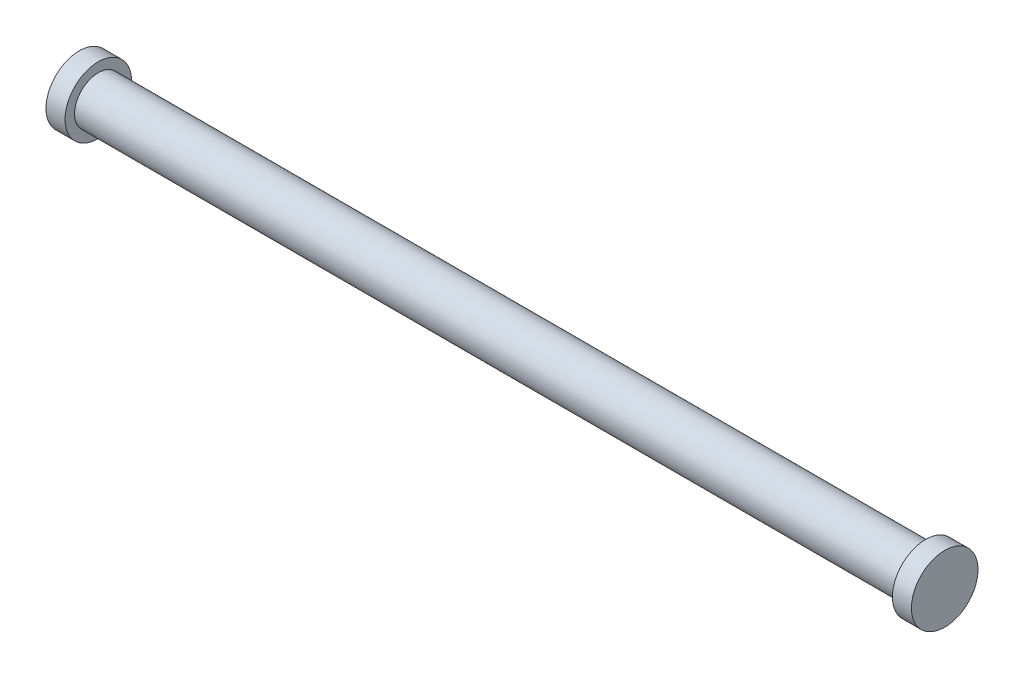
ISO-10303-21;
HEADER;
FILE_DESCRIPTION(('STEP AP214'),'2;1');
FILE_NAME('part.step','',(''),(''),'','','');
FILE_SCHEMA(('AUTOMOTIVE_DESIGN { 1 0 10303 214 1 1 1 1 }'));
ENDSEC;
DATA;
#1=APPLICATION_CONTEXT('core data for automotive mechanical design processes');
#2=APPLICATION_PROTOCOL_DEFINITION('international standard','automotive_design',2000,#1);
#3=PRODUCT_CONTEXT('',#1,'mechanical');
#4=PRODUCT('Part','Part','',(#3));
#5=PRODUCT_RELATED_PRODUCT_CATEGORY('part','',(#4));
#6=PRODUCT_DEFINITION_FORMATION('','',#4);
#7=PRODUCT_DEFINITION_CONTEXT('part definition',#1,'design');
#8=PRODUCT_DEFINITION('design','',#6,#7);
#9=PRODUCT_DEFINITION_SHAPE('','',#8);
#10=(LENGTH_UNIT() NAMED_UNIT(*) SI_UNIT(.MILLI.,.METRE.));
#11=(NAMED_UNIT(*) PLANE_ANGLE_UNIT() SI_UNIT($,.RADIAN.));
#12=(NAMED_UNIT(*) SI_UNIT($,.STERADIAN.) SOLID_ANGLE_UNIT());
#13=UNCERTAINTY_MEASURE_WITH_UNIT(LENGTH_MEASURE(1.E-05),#10,'distance_accuracy_value','');
#14=(GEOMETRIC_REPRESENTATION_CONTEXT(3) GLOBAL_UNCERTAINTY_ASSIGNED_CONTEXT((#13)) GLOBAL_UNIT_ASSIGNED_CONTEXT((#10,
#11,#12)) REPRESENTATION_CONTEXT('',''));
#15=CARTESIAN_POINT('',(0.,0.,0.));
#16=DIRECTION('',(0.,0.,1.));
#17=DIRECTION('',(1.,0.,0.));
#18=AXIS2_PLACEMENT_3D('',#15,#16,#17);
#19=CARTESIAN_POINT('',(-434.9,0.,0.));
#20=DIRECTION('',(1.,0.,0.));
#21=DIRECTION('',(0.,0.,-1.));
#22=AXIS2_PLACEMENT_3D('',#19,#20,#21);
#23=CYLINDRICAL_SURFACE('',#22,12.5);
#24=CARTESIAN_POINT('',(-434.9,0.,0.));
#25=DIRECTION('',(1.,0.,0.));
#26=DIRECTION('',(0.,0.,-1.));
#27=AXIS2_PLACEMENT_3D('',#24,#25,#26);
#28=CIRCLE('',#27,12.5);
#29=CARTESIAN_POINT('',(-434.9,0.,-12.5));
#30=VERTEX_POINT('',#29);
#31=EDGE_CURVE('E48',#30,#30,#28,.T.);
#32=ORIENTED_EDGE('',*,*,#31,.T.);
#33=EDGE_LOOP('',(#32));
#34=FACE_BOUND('',#33,.T.);
#35=CARTESIAN_POINT('',(0.,0.,0.));
#36=DIRECTION('',(1.,0.,0.));
#37=DIRECTION('',(0.,0.,-1.));
#38=AXIS2_PLACEMENT_3D('',#35,#36,#37);
#39=CIRCLE('',#38,12.5);
#40=CARTESIAN_POINT('',(0.,0.,-12.5));
#41=VERTEX_POINT('',#40);
#42=EDGE_CURVE('E10',#41,#41,#39,.T.);
#43=ORIENTED_EDGE('',*,*,#42,.F.);
#44=EDGE_LOOP('',(#43));
#45=FACE_BOUND('',#44,.T.);
#46=ADVANCED_FACE('F33',(#34,#45),#23,.T.);
#47=CARTESIAN_POINT('',(10.,0.,0.));
#48=DIRECTION('',(-1.,0.,0.));
#49=DIRECTION('',(0.,0.,1.));
#50=AXIS2_PLACEMENT_3D('',#47,#48,#49);
#51=CYLINDRICAL_SURFACE('',#50,17.5);
#52=CARTESIAN_POINT('',(10.,0.,0.));
#53=DIRECTION('',(1.,0.,0.));
#54=DIRECTION('',(0.,0.,-1.));
#55=AXIS2_PLACEMENT_3D('',#52,#53,#54);
#56=CIRCLE('',#55,17.5);
#57=CARTESIAN_POINT('',(10.,0.,-17.5));
#58=VERTEX_POINT('',#57);
#59=EDGE_CURVE('E39',#58,#58,#56,.T.);
#60=ORIENTED_EDGE('',*,*,#59,.F.);
#61=EDGE_LOOP('',(#60));
#62=FACE_BOUND('',#61,.T.);
#63=CARTESIAN_POINT('',(0.,0.,0.));
#64=DIRECTION('',(1.,0.,0.));
#65=DIRECTION('',(0.,0.,-1.));
#66=AXIS2_PLACEMENT_3D('',#63,#64,#65);
#67=CIRCLE('',#66,17.5);
#68=CARTESIAN_POINT('',(0.,0.,-17.5));
#69=VERTEX_POINT('',#68);
#70=EDGE_CURVE('E43',#69,#69,#67,.T.);
#71=ORIENTED_EDGE('',*,*,#70,.T.);
#72=EDGE_LOOP('',(#71));
#73=FACE_BOUND('',#72,.T.);
#74=ADVANCED_FACE('F76',(#62,#73),#51,.T.);
#75=CARTESIAN_POINT('',(10.,0.,0.));
#76=DIRECTION('',(1.,0.,0.));
#77=DIRECTION('',(0.,0.,-1.));
#78=AXIS2_PLACEMENT_3D('',#75,#76,#77);
#79=PLANE('',#78);
#80=ORIENTED_EDGE('',*,*,#59,.T.);
#81=EDGE_LOOP('',(#80));
#82=FACE_BOUND('',#81,.T.);
#83=ADVANCED_FACE('F80',(#82),#79,.T.);
#84=CARTESIAN_POINT('',(0.,0.,0.));
#85=DIRECTION('',(1.,0.,0.));
#86=DIRECTION('',(0.,0.,-1.));
#87=AXIS2_PLACEMENT_3D('',#84,#85,#86);
#88=PLANE('',#87);
#89=ORIENTED_EDGE('',*,*,#42,.T.);
#90=EDGE_LOOP('',(#89));
#91=FACE_BOUND('',#90,.T.);
#92=ORIENTED_EDGE('',*,*,#70,.F.);
#93=EDGE_LOOP('',(#92));
#94=FACE_BOUND('',#93,.T.);
#95=ADVANCED_FACE('F86',(#91,#94),#88,.F.);
#96=CARTESIAN_POINT('',(-444.9,0.,0.));
#97=DIRECTION('',(1.,0.,0.));
#98=DIRECTION('',(0.,0.,-1.));
#99=AXIS2_PLACEMENT_3D('',#96,#97,#98);
#100=CYLINDRICAL_SURFACE('',#99,17.5);
#101=CARTESIAN_POINT('',(-444.9,0.,0.));
#102=DIRECTION('',(-1.,0.,0.));
#103=DIRECTION('',(0.,0.,1.));
#104=AXIS2_PLACEMENT_3D('',#101,#102,#103);
#105=CIRCLE('',#104,17.5);
#106=CARTESIAN_POINT('',(-444.9,0.,17.5));
#107=VERTEX_POINT('',#106);
#108=EDGE_CURVE('E54',#107,#107,#105,.T.);
#109=ORIENTED_EDGE('',*,*,#108,.F.);
#110=EDGE_LOOP('',(#109));
#111=FACE_BOUND('',#110,.T.);
#112=CARTESIAN_POINT('',(-434.9,0.,0.));
#113=DIRECTION('',(-1.,0.,0.));
#114=DIRECTION('',(0.,0.,1.));
#115=AXIS2_PLACEMENT_3D('',#112,#113,#114);
#116=CIRCLE('',#115,17.5);
#117=CARTESIAN_POINT('',(-434.9,0.,17.5));
#118=VERTEX_POINT('',#117);
#119=EDGE_CURVE('E51',#118,#118,#116,.T.);
#120=ORIENTED_EDGE('',*,*,#119,.T.);
#121=EDGE_LOOP('',(#120));
#122=FACE_BOUND('',#121,.T.);
#123=ADVANCED_FACE('F63',(#111,#122),#100,.T.);
#124=CARTESIAN_POINT('',(-444.9,0.,0.));
#125=DIRECTION('',(-1.,0.,0.));
#126=DIRECTION('',(0.,0.,1.));
#127=AXIS2_PLACEMENT_3D('',#124,#125,#126);
#128=PLANE('',#127);
#129=ORIENTED_EDGE('',*,*,#108,.T.);
#130=EDGE_LOOP('',(#129));
#131=FACE_BOUND('',#130,.T.);
#132=ADVANCED_FACE('F67',(#131),#128,.T.);
#133=CARTESIAN_POINT('',(-434.9,0.,0.));
#134=DIRECTION('',(-1.,0.,0.));
#135=DIRECTION('',(0.,0.,1.));
#136=AXIS2_PLACEMENT_3D('',#133,#134,#135);
#137=PLANE('',#136);
#138=ORIENTED_EDGE('',*,*,#31,.F.);
#139=EDGE_LOOP('',(#138));
#140=FACE_BOUND('',#139,.T.);
#141=ORIENTED_EDGE('',*,*,#119,.F.);
#142=EDGE_LOOP('',(#141));
#143=FACE_BOUND('',#142,.T.);
#144=ADVANCED_FACE('F65',(#140,#143),#137,.F.);
#145=CLOSED_SHELL('',(#46,#74,#83,#95,#123,#132,#144));
#146=MANIFOLD_SOLID_BREP('B2',#145);
#147=ADVANCED_BREP_SHAPE_REPRESENTATION('',(#18,#146),#14);
#148=SHAPE_DEFINITION_REPRESENTATION(#9,#147);
ENDSEC;
END-ISO-10303-21;
